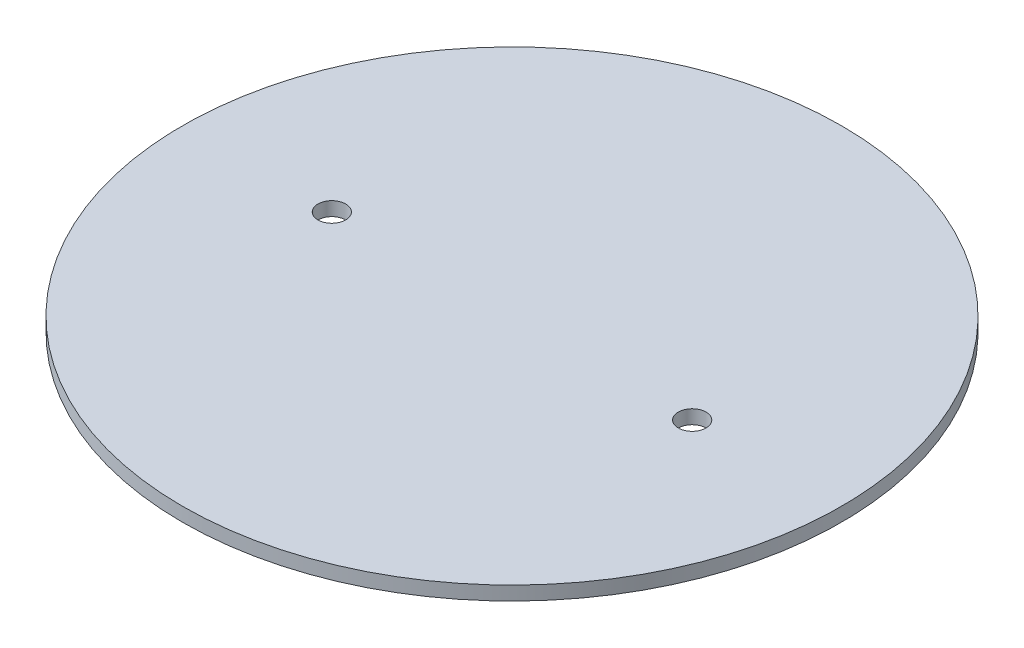
ISO-10303-21;
HEADER;
FILE_DESCRIPTION(('STEP AP214'),'2;1');
FILE_NAME('part.step','',(''),(''),'','','');
FILE_SCHEMA(('AUTOMOTIVE_DESIGN { 1 0 10303 214 1 1 1 1 }'));
ENDSEC;
DATA;
#1=APPLICATION_CONTEXT('core data for automotive mechanical design processes');
#2=APPLICATION_PROTOCOL_DEFINITION('international standard','automotive_design',2000,#1);
#3=PRODUCT_CONTEXT('',#1,'mechanical');
#4=PRODUCT('Part','Part','',(#3));
#5=PRODUCT_RELATED_PRODUCT_CATEGORY('part','',(#4));
#6=PRODUCT_DEFINITION_FORMATION('','',#4);
#7=PRODUCT_DEFINITION_CONTEXT('part definition',#1,'design');
#8=PRODUCT_DEFINITION('design','',#6,#7);
#9=PRODUCT_DEFINITION_SHAPE('','',#8);
#10=(LENGTH_UNIT() NAMED_UNIT(*) SI_UNIT(.MILLI.,.METRE.));
#11=(NAMED_UNIT(*) PLANE_ANGLE_UNIT() SI_UNIT($,.RADIAN.));
#12=(NAMED_UNIT(*) SI_UNIT($,.STERADIAN.) SOLID_ANGLE_UNIT());
#13=UNCERTAINTY_MEASURE_WITH_UNIT(LENGTH_MEASURE(1.E-05),#10,'distance_accuracy_value','');
#14=(GEOMETRIC_REPRESENTATION_CONTEXT(3) GLOBAL_UNCERTAINTY_ASSIGNED_CONTEXT((#13)) GLOBAL_UNIT_ASSIGNED_CONTEXT((#10,
#11,#12)) REPRESENTATION_CONTEXT('',''));
#15=CARTESIAN_POINT('',(0.,0.,0.));
#16=DIRECTION('',(0.,0.,1.));
#17=DIRECTION('',(1.,0.,0.));
#18=AXIS2_PLACEMENT_3D('',#15,#16,#17);
#19=CARTESIAN_POINT('',(0.,3.175,0.));
#20=DIRECTION('',(0.,-1.,0.));
#21=DIRECTION('',(0.,0.,-1.));
#22=AXIS2_PLACEMENT_3D('',#19,#20,#21);
#23=CYLINDRICAL_SURFACE('',#22,75.4888);
#24=CARTESIAN_POINT('',(0.,3.175,0.));
#25=DIRECTION('',(0.,1.,0.));
#26=DIRECTION('',(0.,0.,1.));
#27=AXIS2_PLACEMENT_3D('',#24,#25,#26);
#28=CIRCLE('',#27,75.4888);
#29=CARTESIAN_POINT('',(0.,3.175,75.4888));
#30=VERTEX_POINT('',#29);
#31=EDGE_CURVE('E10',#30,#30,#28,.T.);
#32=ORIENTED_EDGE('',*,*,#31,.F.);
#33=EDGE_LOOP('',(#32));
#34=FACE_BOUND('',#33,.T.);
#35=CARTESIAN_POINT('',(0.,0.,0.));
#36=DIRECTION('',(0.,1.,0.));
#37=DIRECTION('',(0.,0.,1.));
#38=AXIS2_PLACEMENT_3D('',#35,#36,#37);
#39=CIRCLE('',#38,75.4888);
#40=CARTESIAN_POINT('',(0.,0.,75.4888));
#41=VERTEX_POINT('',#40);
#42=EDGE_CURVE('E40',#41,#41,#39,.T.);
#43=ORIENTED_EDGE('',*,*,#42,.T.);
#44=EDGE_LOOP('',(#43));
#45=FACE_BOUND('',#44,.T.);
#46=ADVANCED_FACE('F33',(#34,#45),#23,.T.);
#47=CARTESIAN_POINT('',(0.,3.175,0.));
#48=DIRECTION('',(0.,1.,0.));
#49=DIRECTION('',(0.,0.,1.));
#50=AXIS2_PLACEMENT_3D('',#47,#48,#49);
#51=PLANE('',#50);
#52=CARTESIAN_POINT('',(-41.275,3.175,0.));
#53=DIRECTION('',(0.,1.,0.));
#54=DIRECTION('',(0.,0.,1.));
#55=AXIS2_PLACEMENT_3D('',#52,#53,#54);
#56=CIRCLE('',#55,3.175);
#57=CARTESIAN_POINT('',(-41.275,3.175,3.175));
#58=VERTEX_POINT('',#57);
#59=EDGE_CURVE('E51',#58,#58,#56,.T.);
#60=ORIENTED_EDGE('',*,*,#59,.F.);
#61=EDGE_LOOP('',(#60));
#62=FACE_BOUND('',#61,.T.);
#63=CARTESIAN_POINT('',(41.275,3.175,0.));
#64=DIRECTION('',(0.,1.,0.));
#65=DIRECTION('',(0.,0.,1.));
#66=AXIS2_PLACEMENT_3D('',#63,#64,#65);
#67=CIRCLE('',#66,3.175);
#68=CARTESIAN_POINT('',(41.275,3.175,3.175));
#69=VERTEX_POINT('',#68);
#70=EDGE_CURVE('E47',#69,#69,#67,.T.);
#71=ORIENTED_EDGE('',*,*,#70,.F.);
#72=EDGE_LOOP('',(#71));
#73=FACE_BOUND('',#72,.T.);
#74=ORIENTED_EDGE('',*,*,#31,.T.);
#75=EDGE_LOOP('',(#74));
#76=FACE_BOUND('',#75,.T.);
#77=ADVANCED_FACE('F64',(#62,#73,#76),#51,.T.);
#78=CARTESIAN_POINT('',(0.,0.,0.));
#79=DIRECTION('',(0.,1.,0.));
#80=DIRECTION('',(0.,0.,1.));
#81=AXIS2_PLACEMENT_3D('',#78,#79,#80);
#82=PLANE('',#81);
#83=CARTESIAN_POINT('',(-41.275,0.,0.));
#84=DIRECTION('',(0.,1.,0.));
#85=DIRECTION('',(0.,0.,1.));
#86=AXIS2_PLACEMENT_3D('',#83,#84,#85);
#87=CIRCLE('',#86,3.175);
#88=CARTESIAN_POINT('',(-41.275,0.,3.175));
#89=VERTEX_POINT('',#88);
#90=EDGE_CURVE('E36',#89,#89,#87,.T.);
#91=ORIENTED_EDGE('',*,*,#90,.T.);
#92=EDGE_LOOP('',(#91));
#93=FACE_BOUND('',#92,.T.);
#94=CARTESIAN_POINT('',(41.275,0.,0.));
#95=DIRECTION('',(0.,1.,0.));
#96=DIRECTION('',(0.,0.,1.));
#97=AXIS2_PLACEMENT_3D('',#94,#95,#96);
#98=CIRCLE('',#97,3.175);
#99=CARTESIAN_POINT('',(41.275,0.,3.175));
#100=VERTEX_POINT('',#99);
#101=EDGE_CURVE('E49',#100,#100,#98,.T.);
#102=ORIENTED_EDGE('',*,*,#101,.T.);
#103=EDGE_LOOP('',(#102));
#104=FACE_BOUND('',#103,.T.);
#105=ORIENTED_EDGE('',*,*,#42,.F.);
#106=EDGE_LOOP('',(#105));
#107=FACE_BOUND('',#106,.T.);
#108=ADVANCED_FACE('F66',(#93,#104,#107),#82,.F.);
#109=CARTESIAN_POINT('',(41.275,-1.5875,0.));
#110=DIRECTION('',(0.,1.,0.));
#111=DIRECTION('',(0.,0.,1.));
#112=AXIS2_PLACEMENT_3D('',#109,#110,#111);
#113=CYLINDRICAL_SURFACE('',#112,3.175);
#114=CARTESIAN_POINT('',(41.275,3.175,3.175));
#115=CARTESIAN_POINT('',(41.275,3.14192708333333,3.175));
#116=CARTESIAN_POINT('',(41.275,3.10885416666667,3.175));
#117=CARTESIAN_POINT('',(41.275,3.04270833333333,3.175));
#118=CARTESIAN_POINT('',(41.275,3.00963541666667,3.175));
#119=CARTESIAN_POINT('',(41.275,2.94348958333333,3.175));
#120=CARTESIAN_POINT('',(41.275,2.91041666666667,3.175));
#121=CARTESIAN_POINT('',(41.275,2.84427083333333,3.175));
#122=CARTESIAN_POINT('',(41.275,2.81119791666667,3.175));
#123=CARTESIAN_POINT('',(41.275,2.74505208333333,3.175));
#124=CARTESIAN_POINT('',(41.275,2.71197916666667,3.175));
#125=CARTESIAN_POINT('',(41.275,2.64583333333333,3.175));
#126=CARTESIAN_POINT('',(41.275,2.61276041666667,3.175));
#127=CARTESIAN_POINT('',(41.275,2.54661458333333,3.175));
#128=CARTESIAN_POINT('',(41.275,2.51354166666667,3.175));
#129=CARTESIAN_POINT('',(41.275,2.44739583333333,3.175));
#130=CARTESIAN_POINT('',(41.275,2.41432291666667,3.175));
#131=CARTESIAN_POINT('',(41.275,2.34817708333333,3.175));
#132=CARTESIAN_POINT('',(41.275,2.31510416666667,3.175));
#133=CARTESIAN_POINT('',(41.275,2.24895833333333,3.175));
#134=CARTESIAN_POINT('',(41.275,2.21588541666667,3.175));
#135=CARTESIAN_POINT('',(41.275,2.14973958333333,3.175));
#136=CARTESIAN_POINT('',(41.275,2.11666666666667,3.175));
#137=CARTESIAN_POINT('',(41.275,2.05052083333333,3.175));
#138=CARTESIAN_POINT('',(41.275,2.01744791666667,3.175));
#139=CARTESIAN_POINT('',(41.275,1.95130208333333,3.175));
#140=CARTESIAN_POINT('',(41.275,1.91822916666667,3.175));
#141=CARTESIAN_POINT('',(41.275,1.85208333333333,3.175));
#142=CARTESIAN_POINT('',(41.275,1.81901041666667,3.175));
#143=CARTESIAN_POINT('',(41.275,1.75286458333333,3.175));
#144=CARTESIAN_POINT('',(41.275,1.71979166666667,3.175));
#145=CARTESIAN_POINT('',(41.275,1.65364583333333,3.175));
#146=CARTESIAN_POINT('',(41.275,1.62057291666667,3.175));
#147=CARTESIAN_POINT('',(41.275,1.55442708333333,3.175));
#148=CARTESIAN_POINT('',(41.275,1.52135416666667,3.175));
#149=CARTESIAN_POINT('',(41.275,1.45520833333333,3.175));
#150=CARTESIAN_POINT('',(41.275,1.42213541666667,3.175));
#151=CARTESIAN_POINT('',(41.275,1.35598958333333,3.175));
#152=CARTESIAN_POINT('',(41.275,1.32291666666667,3.175));
#153=CARTESIAN_POINT('',(41.275,1.25677083333333,3.175));
#154=CARTESIAN_POINT('',(41.275,1.22369791666667,3.175));
#155=CARTESIAN_POINT('',(41.275,1.15755208333333,3.175));
#156=CARTESIAN_POINT('',(41.275,1.12447916666667,3.175));
#157=CARTESIAN_POINT('',(41.275,1.05833333333333,3.175));
#158=CARTESIAN_POINT('',(41.275,1.02526041666667,3.175));
#159=CARTESIAN_POINT('',(41.275,0.959114583333333,3.175));
#160=CARTESIAN_POINT('',(41.275,0.926041666666666,3.175));
#161=CARTESIAN_POINT('',(41.275,0.859895833333333,3.175));
#162=CARTESIAN_POINT('',(41.275,0.826822916666666,3.175));
#163=CARTESIAN_POINT('',(41.275,0.760677083333333,3.175));
#164=CARTESIAN_POINT('',(41.275,0.727604166666666,3.175));
#165=CARTESIAN_POINT('',(41.275,0.661458333333333,3.175));
#166=CARTESIAN_POINT('',(41.275,0.628385416666666,3.175));
#167=CARTESIAN_POINT('',(41.275,0.562239583333333,3.175));
#168=CARTESIAN_POINT('',(41.275,0.529166666666666,3.175));
#169=CARTESIAN_POINT('',(41.275,0.463020833333333,3.175));
#170=CARTESIAN_POINT('',(41.275,0.429947916666666,3.175));
#171=CARTESIAN_POINT('',(41.275,0.363802083333333,3.175));
#172=CARTESIAN_POINT('',(41.275,0.330729166666667,3.175));
#173=CARTESIAN_POINT('',(41.275,0.264583333333333,3.175));
#174=CARTESIAN_POINT('',(41.275,0.231510416666666,3.175));
#175=CARTESIAN_POINT('',(41.275,0.165364583333333,3.175));
#176=CARTESIAN_POINT('',(41.275,0.132291666666666,3.175));
#177=CARTESIAN_POINT('',(41.275,0.0661458333333331,3.175));
#178=CARTESIAN_POINT('',(41.275,0.0330729166666665,3.175));
#179=CARTESIAN_POINT('',(41.275,0.,3.175));
#180=B_SPLINE_CURVE_WITH_KNOTS('',3,(#114,#115,#116,#117,#118,#119,#120,#121,#122,#123,#124,
#125,#126,#127,#128,#129,#130,#131,#132,#133,#134,#135,#136,#137,#138,#139,#140,#141,#142,#143,
#144,#145,#146,#147,#148,#149,#150,#151,#152,#153,#154,#155,#156,#157,#158,#159,#160,#161,#162,
#163,#164,#165,#166,#167,#168,#169,#170,#171,#172,#173,#174,#175,#176,#177,#178,#179),
.UNSPECIFIED.,.F.,.F.,(4,2,2,2,2,2,2,2,2,2,2,2,2,2,2,2,2,2,2,2,2,2,2,2,2,2,2,2,2,2,2,2,4),(0.,
0.0992187500000004,0.1984375,0.29765625,0.396875,0.49609375,0.5953125,0.69453125,0.79375,
0.89296875,0.9921875,1.09140625,1.190625,1.28984375,1.3890625,1.48828125,1.5875,1.68671875,
1.7859375,1.88515625,1.984375,2.08359375,2.1828125,2.28203125,2.38125,2.48046875,2.5796875,
2.67890625,2.778125,2.87734375,2.9765625,3.07578125,3.175),.UNSPECIFIED.);
#181=EDGE_CURVE('BSEAM61',#69,#100,#180,.T.);
#182=ORIENTED_EDGE('',*,*,#70,.T.);
#183=ORIENTED_EDGE('',*,*,#101,.F.);
#184=ORIENTED_EDGE('',*,*,#181,.T.);
#185=ORIENTED_EDGE('',*,*,#181,.F.);
#186=EDGE_LOOP('',(#182,#184,#183,#185));
#187=FACE_BOUND('',#186,.T.);
#188=ADVANCED_FACE('F61',(#187),#113,.F.);
#189=CARTESIAN_POINT('',(-41.275,-1.5875,0.));
#190=DIRECTION('',(0.,1.,0.));
#191=DIRECTION('',(0.,0.,1.));
#192=AXIS2_PLACEMENT_3D('',#189,#190,#191);
#193=CYLINDRICAL_SURFACE('',#192,3.175);
#194=CARTESIAN_POINT('',(-41.275,3.175,3.175));
#195=CARTESIAN_POINT('',(-41.275,3.14192708333333,3.175));
#196=CARTESIAN_POINT('',(-41.275,3.10885416666667,3.175));
#197=CARTESIAN_POINT('',(-41.275,3.04270833333333,3.175));
#198=CARTESIAN_POINT('',(-41.275,3.00963541666667,3.175));
#199=CARTESIAN_POINT('',(-41.275,2.94348958333333,3.175));
#200=CARTESIAN_POINT('',(-41.275,2.91041666666667,3.175));
#201=CARTESIAN_POINT('',(-41.275,2.84427083333333,3.175));
#202=CARTESIAN_POINT('',(-41.275,2.81119791666667,3.175));
#203=CARTESIAN_POINT('',(-41.275,2.74505208333333,3.175));
#204=CARTESIAN_POINT('',(-41.275,2.71197916666667,3.175));
#205=CARTESIAN_POINT('',(-41.275,2.64583333333333,3.175));
#206=CARTESIAN_POINT('',(-41.275,2.61276041666667,3.175));
#207=CARTESIAN_POINT('',(-41.275,2.54661458333333,3.175));
#208=CARTESIAN_POINT('',(-41.275,2.51354166666667,3.175));
#209=CARTESIAN_POINT('',(-41.275,2.44739583333333,3.175));
#210=CARTESIAN_POINT('',(-41.275,2.41432291666667,3.175));
#211=CARTESIAN_POINT('',(-41.275,2.34817708333333,3.175));
#212=CARTESIAN_POINT('',(-41.275,2.31510416666667,3.175));
#213=CARTESIAN_POINT('',(-41.275,2.24895833333333,3.175));
#214=CARTESIAN_POINT('',(-41.275,2.21588541666667,3.175));
#215=CARTESIAN_POINT('',(-41.275,2.14973958333333,3.175));
#216=CARTESIAN_POINT('',(-41.275,2.11666666666667,3.175));
#217=CARTESIAN_POINT('',(-41.275,2.05052083333333,3.175));
#218=CARTESIAN_POINT('',(-41.275,2.01744791666667,3.175));
#219=CARTESIAN_POINT('',(-41.275,1.95130208333333,3.175));
#220=CARTESIAN_POINT('',(-41.275,1.91822916666667,3.175));
#221=CARTESIAN_POINT('',(-41.275,1.85208333333333,3.175));
#222=CARTESIAN_POINT('',(-41.275,1.81901041666667,3.175));
#223=CARTESIAN_POINT('',(-41.275,1.75286458333333,3.175));
#224=CARTESIAN_POINT('',(-41.275,1.71979166666667,3.175));
#225=CARTESIAN_POINT('',(-41.275,1.65364583333333,3.175));
#226=CARTESIAN_POINT('',(-41.275,1.62057291666667,3.175));
#227=CARTESIAN_POINT('',(-41.275,1.55442708333333,3.175));
#228=CARTESIAN_POINT('',(-41.275,1.52135416666667,3.175));
#229=CARTESIAN_POINT('',(-41.275,1.45520833333333,3.175));
#230=CARTESIAN_POINT('',(-41.275,1.42213541666667,3.175));
#231=CARTESIAN_POINT('',(-41.275,1.35598958333333,3.175));
#232=CARTESIAN_POINT('',(-41.275,1.32291666666667,3.175));
#233=CARTESIAN_POINT('',(-41.275,1.25677083333333,3.175));
#234=CARTESIAN_POINT('',(-41.275,1.22369791666667,3.175));
#235=CARTESIAN_POINT('',(-41.275,1.15755208333333,3.175));
#236=CARTESIAN_POINT('',(-41.275,1.12447916666667,3.175));
#237=CARTESIAN_POINT('',(-41.275,1.05833333333333,3.175));
#238=CARTESIAN_POINT('',(-41.275,1.02526041666667,3.175));
#239=CARTESIAN_POINT('',(-41.275,0.959114583333333,3.175));
#240=CARTESIAN_POINT('',(-41.275,0.926041666666666,3.175));
#241=CARTESIAN_POINT('',(-41.275,0.859895833333333,3.175));
#242=CARTESIAN_POINT('',(-41.275,0.826822916666666,3.175));
#243=CARTESIAN_POINT('',(-41.275,0.760677083333333,3.175));
#244=CARTESIAN_POINT('',(-41.275,0.727604166666666,3.175));
#245=CARTESIAN_POINT('',(-41.275,0.661458333333333,3.175));
#246=CARTESIAN_POINT('',(-41.275,0.628385416666666,3.175));
#247=CARTESIAN_POINT('',(-41.275,0.562239583333333,3.175));
#248=CARTESIAN_POINT('',(-41.275,0.529166666666666,3.175));
#249=CARTESIAN_POINT('',(-41.275,0.463020833333333,3.175));
#250=CARTESIAN_POINT('',(-41.275,0.429947916666666,3.175));
#251=CARTESIAN_POINT('',(-41.275,0.363802083333333,3.175));
#252=CARTESIAN_POINT('',(-41.275,0.330729166666667,3.175));
#253=CARTESIAN_POINT('',(-41.275,0.264583333333333,3.175));
#254=CARTESIAN_POINT('',(-41.275,0.231510416666666,3.175));
#255=CARTESIAN_POINT('',(-41.275,0.165364583333333,3.175));
#256=CARTESIAN_POINT('',(-41.275,0.132291666666666,3.175));
#257=CARTESIAN_POINT('',(-41.275,0.0661458333333331,3.175));
#258=CARTESIAN_POINT('',(-41.275,0.0330729166666665,3.175));
#259=CARTESIAN_POINT('',(-41.275,0.,3.175));
#260=B_SPLINE_CURVE_WITH_KNOTS('',3,(#194,#195,#196,#197,#198,#199,#200,#201,#202,#203,#204,
#205,#206,#207,#208,#209,#210,#211,#212,#213,#214,#215,#216,#217,#218,#219,#220,#221,#222,#223,
#224,#225,#226,#227,#228,#229,#230,#231,#232,#233,#234,#235,#236,#237,#238,#239,#240,#241,#242,
#243,#244,#245,#246,#247,#248,#249,#250,#251,#252,#253,#254,#255,#256,#257,#258,#259),
.UNSPECIFIED.,.F.,.F.,(4,2,2,2,2,2,2,2,2,2,2,2,2,2,2,2,2,2,2,2,2,2,2,2,2,2,2,2,2,2,2,2,4),(0.,
0.0992187500000004,0.1984375,0.29765625,0.396875,0.49609375,0.5953125,0.69453125,0.79375,
0.89296875,0.9921875,1.09140625,1.190625,1.28984375,1.3890625,1.48828125,1.5875,1.68671875,
1.7859375,1.88515625,1.984375,2.08359375,2.1828125,2.28203125,2.38125,2.48046875,2.5796875,
2.67890625,2.778125,2.87734375,2.9765625,3.07578125,3.175),.UNSPECIFIED.);
#261=EDGE_CURVE('BSEAM78',#58,#89,#260,.T.);
#262=ORIENTED_EDGE('',*,*,#59,.T.);
#263=ORIENTED_EDGE('',*,*,#90,.F.);
#264=ORIENTED_EDGE('',*,*,#261,.T.);
#265=ORIENTED_EDGE('',*,*,#261,.F.);
#266=EDGE_LOOP('',(#262,#264,#263,#265));
#267=FACE_BOUND('',#266,.T.);
#268=ADVANCED_FACE('F78',(#267),#193,.F.);
#269=CLOSED_SHELL('',(#46,#77,#108,#188,#268));
#270=MANIFOLD_SOLID_BREP('B2',#269);
#271=ADVANCED_BREP_SHAPE_REPRESENTATION('',(#18,#270),#14);
#272=SHAPE_DEFINITION_REPRESENTATION(#9,#271);
ENDSEC;
END-ISO-10303-21;
